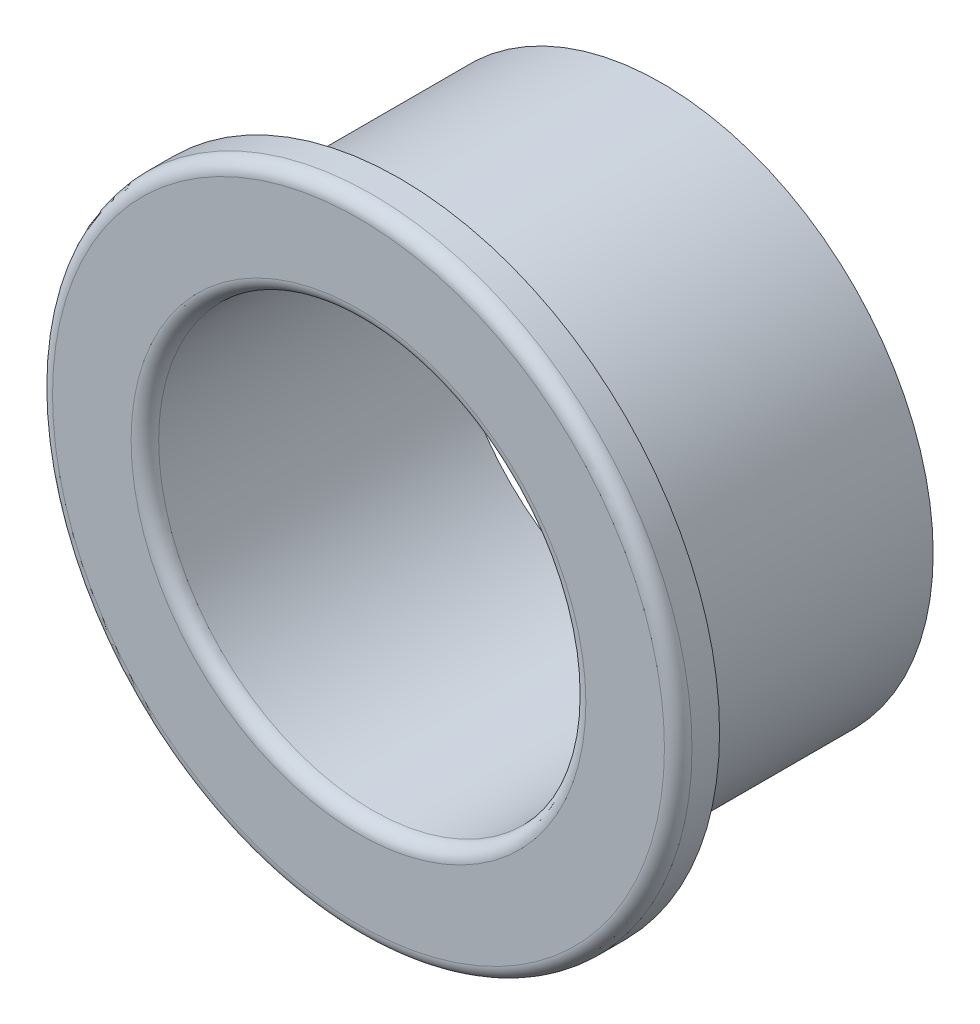
ISO-10303-21;
HEADER;
FILE_DESCRIPTION(('STEP AP214'),'2;1');
FILE_NAME('part.step','',(''),(''),'','','');
FILE_SCHEMA(('AUTOMOTIVE_DESIGN { 1 0 10303 214 1 1 1 1 }'));
ENDSEC;
DATA;
#1=APPLICATION_CONTEXT('core data for automotive mechanical design processes');
#2=APPLICATION_PROTOCOL_DEFINITION('international standard','automotive_design',2000,#1);
#3=PRODUCT_CONTEXT('',#1,'mechanical');
#4=PRODUCT('Part','Part','',(#3));
#5=PRODUCT_RELATED_PRODUCT_CATEGORY('part','',(#4));
#6=PRODUCT_DEFINITION_FORMATION('','',#4);
#7=PRODUCT_DEFINITION_CONTEXT('part definition',#1,'design');
#8=PRODUCT_DEFINITION('design','',#6,#7);
#9=PRODUCT_DEFINITION_SHAPE('','',#8);
#10=(LENGTH_UNIT() NAMED_UNIT(*) SI_UNIT(.MILLI.,.METRE.));
#11=(NAMED_UNIT(*) PLANE_ANGLE_UNIT() SI_UNIT($,.RADIAN.));
#12=(NAMED_UNIT(*) SI_UNIT($,.STERADIAN.) SOLID_ANGLE_UNIT());
#13=UNCERTAINTY_MEASURE_WITH_UNIT(LENGTH_MEASURE(1.E-05),#10,'distance_accuracy_value','');
#14=(GEOMETRIC_REPRESENTATION_CONTEXT(3) GLOBAL_UNCERTAINTY_ASSIGNED_CONTEXT((#13)) GLOBAL_UNIT_ASSIGNED_CONTEXT((#10,
#11,#12)) REPRESENTATION_CONTEXT('',''));
#15=CARTESIAN_POINT('',(0.,0.,0.));
#16=DIRECTION('',(0.,0.,1.));
#17=DIRECTION('',(1.,0.,0.));
#18=AXIS2_PLACEMENT_3D('',#15,#16,#17);
#19=CARTESIAN_POINT('',(0.,0.,1.5));
#20=DIRECTION('',(0.,0.,-1.));
#21=DIRECTION('',(-1.,0.,0.));
#22=AXIS2_PLACEMENT_3D('',#19,#20,#21);
#23=CYLINDRICAL_SURFACE('',#22,11.6);
#24=CARTESIAN_POINT('',(0.,0.,1.));
#25=DIRECTION('',(0.,0.,1.));
#26=DIRECTION('',(1.,0.,0.));
#27=AXIS2_PLACEMENT_3D('',#24,#25,#26);
#28=CIRCLE('',#27,11.6);
#29=CARTESIAN_POINT('',(11.6,0.,1.));
#30=VERTEX_POINT('',#29);
#31=EDGE_CURVE('E27',#30,#30,#28,.F.);
#32=ORIENTED_EDGE('',*,*,#31,.T.);
#33=EDGE_LOOP('',(#32));
#34=FACE_BOUND('',#33,.T.);
#35=CARTESIAN_POINT('',(0.,0.,0.));
#36=DIRECTION('',(0.,0.,1.));
#37=DIRECTION('',(1.,0.,0.));
#38=AXIS2_PLACEMENT_3D('',#35,#36,#37);
#39=CIRCLE('',#38,11.6);
#40=CARTESIAN_POINT('',(11.6,0.,0.));
#41=VERTEX_POINT('',#40);
#42=EDGE_CURVE('E34',#41,#41,#39,.T.);
#43=ORIENTED_EDGE('',*,*,#42,.T.);
#44=EDGE_LOOP('',(#43));
#45=FACE_BOUND('',#44,.T.);
#46=ADVANCED_FACE('F15',(#34,#45),#23,.T.);
#47=CARTESIAN_POINT('',(0.,0.,1.5));
#48=DIRECTION('',(0.,0.,1.));
#49=DIRECTION('',(1.,0.,0.));
#50=AXIS2_PLACEMENT_3D('',#47,#48,#49);
#51=PLANE('',#50);
#52=CARTESIAN_POINT('',(0.,0.,1.5));
#53=DIRECTION('',(0.,0.,1.));
#54=DIRECTION('',(1.,0.,0.));
#55=AXIS2_PLACEMENT_3D('',#52,#53,#54);
#56=CIRCLE('',#55,8.25);
#57=CARTESIAN_POINT('',(8.25,0.,1.5));
#58=VERTEX_POINT('',#57);
#59=EDGE_CURVE('E10',#58,#58,#56,.F.);
#60=ORIENTED_EDGE('',*,*,#59,.T.);
#61=EDGE_LOOP('',(#60));
#62=FACE_BOUND('',#61,.T.);
#63=CARTESIAN_POINT('',(0.,0.,1.5));
#64=DIRECTION('',(0.,0.,1.));
#65=DIRECTION('',(1.,0.,0.));
#66=AXIS2_PLACEMENT_3D('',#63,#64,#65);
#67=CIRCLE('',#66,11.1);
#68=CARTESIAN_POINT('',(11.1,0.,1.5));
#69=VERTEX_POINT('',#68);
#70=EDGE_CURVE('E28',#69,#69,#67,.T.);
#71=ORIENTED_EDGE('',*,*,#70,.T.);
#72=EDGE_LOOP('',(#71));
#73=FACE_BOUND('',#72,.T.);
#74=ADVANCED_FACE('F65',(#62,#73),#51,.T.);
#75=CARTESIAN_POINT('',(0.,0.,0.));
#76=DIRECTION('',(0.,0.,1.));
#77=DIRECTION('',(1.,0.,0.));
#78=AXIS2_PLACEMENT_3D('',#75,#76,#77);
#79=PLANE('',#78);
#80=CARTESIAN_POINT('',(0.,0.,0.));
#81=DIRECTION('',(0.,0.,1.));
#82=DIRECTION('',(1.,0.,0.));
#83=AXIS2_PLACEMENT_3D('',#80,#81,#82);
#84=CIRCLE('',#83,9.85);
#85=CARTESIAN_POINT('',(9.85,0.,0.));
#86=VERTEX_POINT('',#85);
#87=EDGE_CURVE('E38',#86,#86,#84,.T.);
#88=ORIENTED_EDGE('',*,*,#87,.T.);
#89=EDGE_LOOP('',(#88));
#90=FACE_BOUND('',#89,.T.);
#91=ORIENTED_EDGE('',*,*,#42,.F.);
#92=EDGE_LOOP('',(#91));
#93=FACE_BOUND('',#92,.T.);
#94=ADVANCED_FACE('F71',(#90,#93),#79,.F.);
#95=CARTESIAN_POINT('',(0.,0.,-9.5));
#96=DIRECTION('',(0.,0.,1.));
#97=DIRECTION('',(1.,0.,0.));
#98=AXIS2_PLACEMENT_3D('',#95,#96,#97);
#99=CYLINDRICAL_SURFACE('',#98,9.85);
#100=CARTESIAN_POINT('',(0.,0.,-9.5));
#101=DIRECTION('',(0.,0.,1.));
#102=DIRECTION('',(1.,0.,0.));
#103=AXIS2_PLACEMENT_3D('',#100,#101,#102);
#104=CIRCLE('',#103,9.85);
#105=CARTESIAN_POINT('',(9.85,0.,-9.5));
#106=VERTEX_POINT('',#105);
#107=EDGE_CURVE('E39',#106,#106,#104,.T.);
#108=ORIENTED_EDGE('',*,*,#107,.T.);
#109=EDGE_LOOP('',(#108));
#110=FACE_BOUND('',#109,.T.);
#111=ORIENTED_EDGE('',*,*,#87,.F.);
#112=EDGE_LOOP('',(#111));
#113=FACE_BOUND('',#112,.T.);
#114=ADVANCED_FACE('F62',(#110,#113),#99,.T.);
#115=CARTESIAN_POINT('',(0.,0.,-9.5));
#116=DIRECTION('',(0.,0.,1.));
#117=DIRECTION('',(1.,0.,0.));
#118=AXIS2_PLACEMENT_3D('',#115,#116,#117);
#119=PLANE('',#118);
#120=CARTESIAN_POINT('',(0.,0.,-9.5));
#121=DIRECTION('',(0.,0.,1.));
#122=DIRECTION('',(1.,0.,0.));
#123=AXIS2_PLACEMENT_3D('',#120,#121,#122);
#124=CIRCLE('',#123,7.75);
#125=CARTESIAN_POINT('',(7.75,0.,-9.5));
#126=VERTEX_POINT('',#125);
#127=EDGE_CURVE('E42',#126,#126,#124,.T.);
#128=ORIENTED_EDGE('',*,*,#127,.T.);
#129=EDGE_LOOP('',(#128));
#130=FACE_BOUND('',#129,.T.);
#131=ORIENTED_EDGE('',*,*,#107,.F.);
#132=EDGE_LOOP('',(#131));
#133=FACE_BOUND('',#132,.T.);
#134=ADVANCED_FACE('F48',(#130,#133),#119,.F.);
#135=CARTESIAN_POINT('',(0.,0.,-9.5));
#136=DIRECTION('',(0.,0.,1.));
#137=DIRECTION('',(1.,0.,0.));
#138=AXIS2_PLACEMENT_3D('',#135,#136,#137);
#139=CYLINDRICAL_SURFACE('',#138,7.75);
#140=CARTESIAN_POINT('',(0.,0.,1.));
#141=DIRECTION('',(0.,0.,1.));
#142=DIRECTION('',(1.,0.,0.));
#143=AXIS2_PLACEMENT_3D('',#140,#141,#142);
#144=CIRCLE('',#143,7.75);
#145=CARTESIAN_POINT('',(7.75,0.,1.));
#146=VERTEX_POINT('',#145);
#147=EDGE_CURVE('E22',#146,#146,#144,.T.);
#148=ORIENTED_EDGE('',*,*,#147,.T.);
#149=EDGE_LOOP('',(#148));
#150=FACE_BOUND('',#149,.T.);
#151=ORIENTED_EDGE('',*,*,#127,.F.);
#152=EDGE_LOOP('',(#151));
#153=FACE_BOUND('',#152,.T.);
#154=ADVANCED_FACE('F51',(#150,#153),#139,.F.);
#155=CARTESIAN_POINT('',(0.,0.,1.));
#156=DIRECTION('',(0.,0.,1.));
#157=DIRECTION('',(1.,0.,0.));
#158=AXIS2_PLACEMENT_3D('',#155,#156,#157);
#159=TOROIDAL_SURFACE('',#158,11.1,0.5);
#160=ORIENTED_EDGE('',*,*,#31,.F.);
#161=EDGE_LOOP('',(#160));
#162=FACE_BOUND('',#161,.T.);
#163=ORIENTED_EDGE('',*,*,#70,.F.);
#164=EDGE_LOOP('',(#163));
#165=FACE_BOUND('',#164,.T.);
#166=ADVANCED_FACE('F52',(#162,#165),#159,.T.);
#167=CARTESIAN_POINT('',(0.,0.,1.));
#168=DIRECTION('',(0.,0.,1.));
#169=DIRECTION('',(1.,0.,0.));
#170=AXIS2_PLACEMENT_3D('',#167,#168,#169);
#171=TOROIDAL_SURFACE('',#170,8.25,0.5);
#172=ORIENTED_EDGE('',*,*,#59,.F.);
#173=EDGE_LOOP('',(#172));
#174=FACE_BOUND('',#173,.T.);
#175=ORIENTED_EDGE('',*,*,#147,.F.);
#176=EDGE_LOOP('',(#175));
#177=FACE_BOUND('',#176,.T.);
#178=ADVANCED_FACE('F17',(#174,#177),#171,.T.);
#179=CLOSED_SHELL('',(#46,#74,#94,#114,#134,#154,#166,#178));
#180=MANIFOLD_SOLID_BREP('B1',#179);
#181=ADVANCED_BREP_SHAPE_REPRESENTATION('',(#18,#180),#14);
#182=SHAPE_DEFINITION_REPRESENTATION(#9,#181);
ENDSEC;
END-ISO-10303-21;
